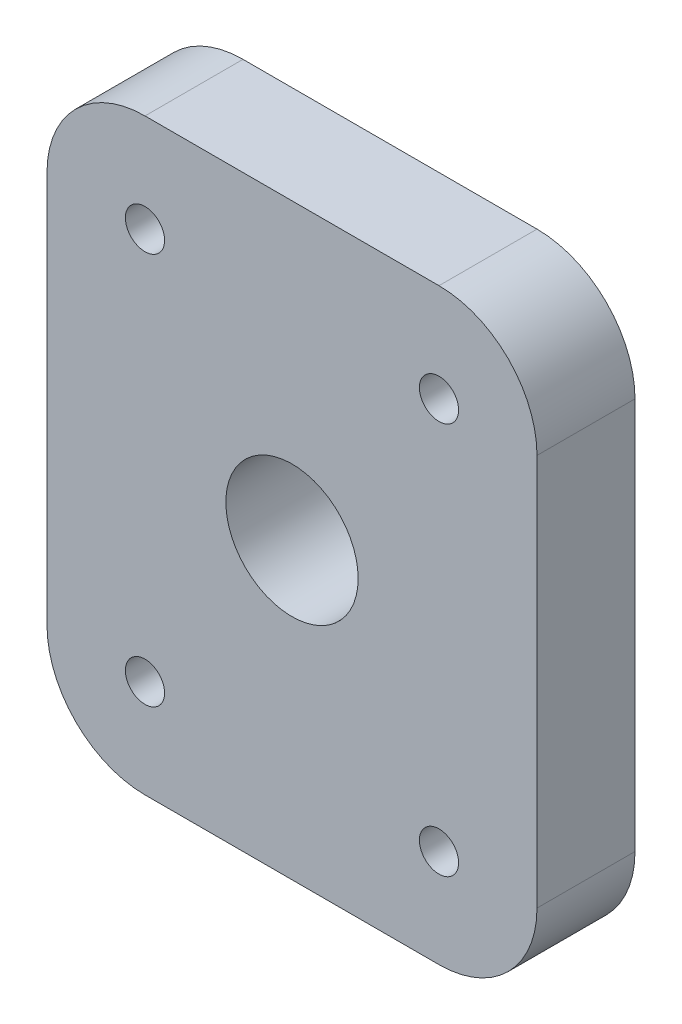
ISO-10303-21;
HEADER;
FILE_DESCRIPTION(('STEP AP214'),'2;1');
FILE_NAME('part.step','',(''),(''),'','','');
FILE_SCHEMA(('AUTOMOTIVE_DESIGN { 1 0 10303 214 1 1 1 1 }'));
ENDSEC;
DATA;
#1=APPLICATION_CONTEXT('core data for automotive mechanical design processes');
#2=APPLICATION_PROTOCOL_DEFINITION('international standard','automotive_design',2000,#1);
#3=PRODUCT_CONTEXT('',#1,'mechanical');
#4=PRODUCT('Part','Part','',(#3));
#5=PRODUCT_RELATED_PRODUCT_CATEGORY('part','',(#4));
#6=PRODUCT_DEFINITION_FORMATION('','',#4);
#7=PRODUCT_DEFINITION_CONTEXT('part definition',#1,'design');
#8=PRODUCT_DEFINITION('design','',#6,#7);
#9=PRODUCT_DEFINITION_SHAPE('','',#8);
#10=(LENGTH_UNIT() NAMED_UNIT(*) SI_UNIT(.MILLI.,.METRE.));
#11=(NAMED_UNIT(*) PLANE_ANGLE_UNIT() SI_UNIT($,.RADIAN.));
#12=(NAMED_UNIT(*) SI_UNIT($,.STERADIAN.) SOLID_ANGLE_UNIT());
#13=UNCERTAINTY_MEASURE_WITH_UNIT(LENGTH_MEASURE(1.E-05),#10,'distance_accuracy_value','');
#14=(GEOMETRIC_REPRESENTATION_CONTEXT(3) GLOBAL_UNCERTAINTY_ASSIGNED_CONTEXT((#13)) GLOBAL_UNIT_ASSIGNED_CONTEXT((#10,
#11,#12)) REPRESENTATION_CONTEXT('',''));
#15=CARTESIAN_POINT('',(0.,0.,0.));
#16=DIRECTION('',(0.,0.,1.));
#17=DIRECTION('',(1.,0.,0.));
#18=AXIS2_PLACEMENT_3D('',#15,#16,#17);
#19=CARTESIAN_POINT('',(116.9105691057,50.,10.));
#20=DIRECTION('',(0.,0.,1.));
#21=DIRECTION('',(1.,0.,0.));
#22=AXIS2_PLACEMENT_3D('',#19,#20,#21);
#23=PLANE('',#22);
#24=CARTESIAN_POINT('',(116.9105691057,50.,10.));
#25=DIRECTION('',(0.,0.,1.));
#26=DIRECTION('',(1.,0.,0.));
#27=AXIS2_PLACEMENT_3D('',#24,#25,#26);
#28=CIRCLE('',#27,2.00000000000003);
#29=CARTESIAN_POINT('',(118.9105691057,50.,10.));
#30=VERTEX_POINT('',#29);
#31=EDGE_CURVE('E194',#30,#30,#28,.T.);
#32=ORIENTED_EDGE('',*,*,#31,.F.);
#33=EDGE_LOOP('',(#32));
#34=FACE_BOUND('',#33,.T.);
#35=CARTESIAN_POINT('',(146.9105691057,10.,10.));
#36=DIRECTION('',(0.,0.,1.));
#37=DIRECTION('',(1.,0.,0.));
#38=AXIS2_PLACEMENT_3D('',#35,#36,#37);
#39=CIRCLE('',#38,2.00000000000006);
#40=CARTESIAN_POINT('',(148.9105691057,10.,10.));
#41=VERTEX_POINT('',#40);
#42=EDGE_CURVE('E182',#41,#41,#39,.T.);
#43=ORIENTED_EDGE('',*,*,#42,.F.);
#44=EDGE_LOOP('',(#43));
#45=FACE_BOUND('',#44,.T.);
#46=CARTESIAN_POINT('',(116.9105691057,50.,10.));
#47=DIRECTION('',(0.,0.,1.));
#48=DIRECTION('',(1.,0.,0.));
#49=AXIS2_PLACEMENT_3D('',#46,#47,#48);
#50=CIRCLE('',#49,10.);
#51=CARTESIAN_POINT('',(116.9105691057,60.,10.));
#52=VERTEX_POINT('',#51);
#53=CARTESIAN_POINT('',(106.9105691057,50.,10.));
#54=VERTEX_POINT('',#53);
#55=EDGE_CURVE('E145',#52,#54,#50,.T.);
#56=ORIENTED_EDGE('',*,*,#55,.T.);
#57=DIRECTION('',(0.,-1.,0.));
#58=VECTOR('',#57,1.);
#59=CARTESIAN_POINT('',(106.9105691057,50.,10.));
#60=LINE('',#59,#58);
#61=CARTESIAN_POINT('',(106.9105691057,10.,10.));
#62=VERTEX_POINT('',#61);
#63=EDGE_CURVE('E93',#54,#62,#60,.T.);
#64=ORIENTED_EDGE('',*,*,#63,.T.);
#65=CARTESIAN_POINT('',(116.9105691057,10.,10.));
#66=DIRECTION('',(0.,0.,1.));
#67=DIRECTION('',(1.,0.,0.));
#68=AXIS2_PLACEMENT_3D('',#65,#66,#67);
#69=CIRCLE('',#68,10.);
#70=CARTESIAN_POINT('',(116.9105691057,0.,10.));
#71=VERTEX_POINT('',#70);
#72=EDGE_CURVE('E160',#62,#71,#69,.T.);
#73=ORIENTED_EDGE('',*,*,#72,.T.);
#74=DIRECTION('',(1.,0.,0.));
#75=VECTOR('',#74,1.);
#76=CARTESIAN_POINT('',(116.9105691057,0.,10.));
#77=LINE('',#76,#75);
#78=CARTESIAN_POINT('',(146.9105691057,0.,10.));
#79=VERTEX_POINT('',#78);
#80=EDGE_CURVE('E173',#71,#79,#77,.T.);
#81=ORIENTED_EDGE('',*,*,#80,.T.);
#82=CARTESIAN_POINT('',(146.9105691057,10.,10.));
#83=DIRECTION('',(0.,0.,1.));
#84=DIRECTION('',(1.,0.,0.));
#85=AXIS2_PLACEMENT_3D('',#82,#83,#84);
#86=CIRCLE('',#85,10.);
#87=CARTESIAN_POINT('',(156.9105691057,10.,10.));
#88=VERTEX_POINT('',#87);
#89=EDGE_CURVE('E112',#79,#88,#86,.T.);
#90=ORIENTED_EDGE('',*,*,#89,.T.);
#91=DIRECTION('',(0.,1.,0.));
#92=VECTOR('',#91,1.);
#93=CARTESIAN_POINT('',(156.9105691057,10.,10.));
#94=LINE('',#93,#92);
#95=CARTESIAN_POINT('',(156.9105691057,50.,10.));
#96=VERTEX_POINT('',#95);
#97=EDGE_CURVE('E106',#88,#96,#94,.T.);
#98=ORIENTED_EDGE('',*,*,#97,.T.);
#99=CARTESIAN_POINT('',(146.9105691057,50.,10.));
#100=DIRECTION('',(0.,0.,1.));
#101=DIRECTION('',(1.,0.,0.));
#102=AXIS2_PLACEMENT_3D('',#99,#100,#101);
#103=CIRCLE('',#102,10.);
#104=CARTESIAN_POINT('',(146.9105691057,60.,10.));
#105=VERTEX_POINT('',#104);
#106=EDGE_CURVE('E110',#96,#105,#103,.T.);
#107=ORIENTED_EDGE('',*,*,#106,.T.);
#108=DIRECTION('',(-1.,0.,0.));
#109=VECTOR('',#108,1.);
#110=CARTESIAN_POINT('',(146.9105691057,60.,10.));
#111=LINE('',#110,#109);
#112=EDGE_CURVE('E50',#105,#52,#111,.T.);
#113=ORIENTED_EDGE('',*,*,#112,.T.);
#114=EDGE_LOOP('',(#56,#64,#73,#81,#90,#98,#107,#113));
#115=FACE_BOUND('',#114,.T.);
#116=CARTESIAN_POINT('',(131.9105691057,30.,10.));
#117=DIRECTION('',(0.,0.,1.));
#118=DIRECTION('',(1.,0.,0.));
#119=AXIS2_PLACEMENT_3D('',#116,#117,#118);
#120=CIRCLE('',#119,6.75000000000012);
#121=CARTESIAN_POINT('',(138.6605691057,30.,10.));
#122=VERTEX_POINT('',#121);
#123=EDGE_CURVE('E134',#122,#122,#120,.T.);
#124=ORIENTED_EDGE('',*,*,#123,.F.);
#125=EDGE_LOOP('',(#124));
#126=FACE_BOUND('',#125,.T.);
#127=CARTESIAN_POINT('',(146.9105691057,50.,10.));
#128=DIRECTION('',(0.,0.,1.));
#129=DIRECTION('',(1.,0.,0.));
#130=AXIS2_PLACEMENT_3D('',#127,#128,#129);
#131=CIRCLE('',#130,2.00000000000003);
#132=CARTESIAN_POINT('',(148.9105691057,50.,10.));
#133=VERTEX_POINT('',#132);
#134=EDGE_CURVE('E188',#133,#133,#131,.T.);
#135=ORIENTED_EDGE('',*,*,#134,.F.);
#136=EDGE_LOOP('',(#135));
#137=FACE_BOUND('',#136,.T.);
#138=CARTESIAN_POINT('',(116.9105691057,10.,10.));
#139=DIRECTION('',(0.,0.,1.));
#140=DIRECTION('',(1.,0.,0.));
#141=AXIS2_PLACEMENT_3D('',#138,#139,#140);
#142=CIRCLE('',#141,2.00000000000003);
#143=CARTESIAN_POINT('',(118.9105691057,10.,10.));
#144=VERTEX_POINT('',#143);
#145=EDGE_CURVE('E200',#144,#144,#142,.T.);
#146=ORIENTED_EDGE('',*,*,#145,.F.);
#147=EDGE_LOOP('',(#146));
#148=FACE_BOUND('',#147,.T.);
#149=ADVANCED_FACE('F33',(#34,#45,#115,#126,#137,#148),#23,.T.);
#150=CARTESIAN_POINT('',(116.9105691057,50.,0.));
#151=DIRECTION('',(0.,0.,1.));
#152=DIRECTION('',(1.,0.,0.));
#153=AXIS2_PLACEMENT_3D('',#150,#151,#152);
#154=PLANE('',#153);
#155=CARTESIAN_POINT('',(116.9105691057,50.,0.));
#156=DIRECTION('',(0.,0.,1.));
#157=DIRECTION('',(1.,0.,0.));
#158=AXIS2_PLACEMENT_3D('',#155,#156,#157);
#159=CIRCLE('',#158,10.);
#160=CARTESIAN_POINT('',(116.9105691057,60.,0.));
#161=VERTEX_POINT('',#160);
#162=CARTESIAN_POINT('',(106.9105691057,50.,0.));
#163=VERTEX_POINT('',#162);
#164=EDGE_CURVE('E130',#161,#163,#159,.T.);
#165=ORIENTED_EDGE('',*,*,#164,.F.);
#166=DIRECTION('',(-1.,0.,0.));
#167=VECTOR('',#166,1.);
#168=CARTESIAN_POINT('',(146.9105691057,60.,0.));
#169=LINE('',#168,#167);
#170=CARTESIAN_POINT('',(146.9105691057,60.,0.));
#171=VERTEX_POINT('',#170);
#172=EDGE_CURVE('E85',#171,#161,#169,.T.);
#173=ORIENTED_EDGE('',*,*,#172,.F.);
#174=CARTESIAN_POINT('',(146.9105691057,50.,0.));
#175=DIRECTION('',(0.,0.,1.));
#176=DIRECTION('',(1.,0.,0.));
#177=AXIS2_PLACEMENT_3D('',#174,#175,#176);
#178=CIRCLE('',#177,10.);
#179=CARTESIAN_POINT('',(156.9105691057,50.,0.));
#180=VERTEX_POINT('',#179);
#181=EDGE_CURVE('E79',#180,#171,#178,.T.);
#182=ORIENTED_EDGE('',*,*,#181,.F.);
#183=DIRECTION('',(0.,1.,0.));
#184=VECTOR('',#183,1.);
#185=CARTESIAN_POINT('',(156.9105691057,10.,0.));
#186=LINE('',#185,#184);
#187=CARTESIAN_POINT('',(156.9105691057,10.,0.));
#188=VERTEX_POINT('',#187);
#189=EDGE_CURVE('E120',#188,#180,#186,.T.);
#190=ORIENTED_EDGE('',*,*,#189,.F.);
#191=CARTESIAN_POINT('',(146.9105691057,10.,0.));
#192=DIRECTION('',(0.,0.,1.));
#193=DIRECTION('',(1.,0.,0.));
#194=AXIS2_PLACEMENT_3D('',#191,#192,#193);
#195=CIRCLE('',#194,10.);
#196=CARTESIAN_POINT('',(146.9105691057,0.,0.));
#197=VERTEX_POINT('',#196);
#198=EDGE_CURVE('E140',#197,#188,#195,.T.);
#199=ORIENTED_EDGE('',*,*,#198,.F.);
#200=DIRECTION('',(1.,0.,0.));
#201=VECTOR('',#200,1.);
#202=CARTESIAN_POINT('',(116.9105691057,0.,0.));
#203=LINE('',#202,#201);
#204=CARTESIAN_POINT('',(116.9105691057,0.,0.));
#205=VERTEX_POINT('',#204);
#206=EDGE_CURVE('E138',#205,#197,#203,.T.);
#207=ORIENTED_EDGE('',*,*,#206,.F.);
#208=CARTESIAN_POINT('',(116.9105691057,10.,0.));
#209=DIRECTION('',(0.,0.,1.));
#210=DIRECTION('',(1.,0.,0.));
#211=AXIS2_PLACEMENT_3D('',#208,#209,#210);
#212=CIRCLE('',#211,10.);
#213=CARTESIAN_POINT('',(106.9105691057,10.,0.));
#214=VERTEX_POINT('',#213);
#215=EDGE_CURVE('E136',#214,#205,#212,.T.);
#216=ORIENTED_EDGE('',*,*,#215,.F.);
#217=DIRECTION('',(0.,-1.,0.));
#218=VECTOR('',#217,1.);
#219=CARTESIAN_POINT('',(106.9105691057,50.,0.));
#220=LINE('',#219,#218);
#221=EDGE_CURVE('E133',#163,#214,#220,.T.);
#222=ORIENTED_EDGE('',*,*,#221,.F.);
#223=EDGE_LOOP('',(#165,#173,#182,#190,#199,#207,#216,#222));
#224=FACE_BOUND('',#223,.T.);
#225=CARTESIAN_POINT('',(131.9105691057,30.,0.));
#226=DIRECTION('',(0.,0.,1.));
#227=DIRECTION('',(1.,0.,0.));
#228=AXIS2_PLACEMENT_3D('',#225,#226,#227);
#229=CIRCLE('',#228,6.75000000000012);
#230=CARTESIAN_POINT('',(138.6605691057,30.,0.));
#231=VERTEX_POINT('',#230);
#232=EDGE_CURVE('E179',#231,#231,#229,.T.);
#233=ORIENTED_EDGE('',*,*,#232,.T.);
#234=EDGE_LOOP('',(#233));
#235=FACE_BOUND('',#234,.T.);
#236=CARTESIAN_POINT('',(146.9105691057,10.,0.));
#237=DIRECTION('',(0.,0.,1.));
#238=DIRECTION('',(1.,0.,0.));
#239=AXIS2_PLACEMENT_3D('',#236,#237,#238);
#240=CIRCLE('',#239,2.00000000000006);
#241=CARTESIAN_POINT('',(148.9105691057,10.,0.));
#242=VERTEX_POINT('',#241);
#243=EDGE_CURVE('E185',#242,#242,#240,.T.);
#244=ORIENTED_EDGE('',*,*,#243,.T.);
#245=EDGE_LOOP('',(#244));
#246=FACE_BOUND('',#245,.T.);
#247=CARTESIAN_POINT('',(146.9105691057,50.,0.));
#248=DIRECTION('',(0.,0.,1.));
#249=DIRECTION('',(1.,0.,0.));
#250=AXIS2_PLACEMENT_3D('',#247,#248,#249);
#251=CIRCLE('',#250,2.00000000000003);
#252=CARTESIAN_POINT('',(148.9105691057,50.,0.));
#253=VERTEX_POINT('',#252);
#254=EDGE_CURVE('E191',#253,#253,#251,.T.);
#255=ORIENTED_EDGE('',*,*,#254,.T.);
#256=EDGE_LOOP('',(#255));
#257=FACE_BOUND('',#256,.T.);
#258=CARTESIAN_POINT('',(116.9105691057,50.,0.));
#259=DIRECTION('',(0.,0.,1.));
#260=DIRECTION('',(1.,0.,0.));
#261=AXIS2_PLACEMENT_3D('',#258,#259,#260);
#262=CIRCLE('',#261,2.00000000000003);
#263=CARTESIAN_POINT('',(118.9105691057,50.,0.));
#264=VERTEX_POINT('',#263);
#265=EDGE_CURVE('E197',#264,#264,#262,.T.);
#266=ORIENTED_EDGE('',*,*,#265,.T.);
#267=EDGE_LOOP('',(#266));
#268=FACE_BOUND('',#267,.T.);
#269=CARTESIAN_POINT('',(116.9105691057,10.,0.));
#270=DIRECTION('',(0.,0.,1.));
#271=DIRECTION('',(1.,0.,0.));
#272=AXIS2_PLACEMENT_3D('',#269,#270,#271);
#273=CIRCLE('',#272,2.00000000000003);
#274=CARTESIAN_POINT('',(118.9105691057,10.,0.));
#275=VERTEX_POINT('',#274);
#276=EDGE_CURVE('E203',#275,#275,#273,.T.);
#277=ORIENTED_EDGE('',*,*,#276,.T.);
#278=EDGE_LOOP('',(#277));
#279=FACE_BOUND('',#278,.T.);
#280=ADVANCED_FACE('F164',(#224,#235,#246,#257,#268,#279),#154,.F.);
#281=CARTESIAN_POINT('',(116.9105691057,50.,10.));
#282=DIRECTION('',(0.,0.,-1.));
#283=DIRECTION('',(-1.,0.,0.));
#284=AXIS2_PLACEMENT_3D('',#281,#282,#283);
#285=CYLINDRICAL_SURFACE('',#284,10.);
#286=ORIENTED_EDGE('',*,*,#164,.T.);
#287=DIRECTION('',(0.,0.,-1.));
#288=VECTOR('',#287,1.);
#289=CARTESIAN_POINT('',(106.9105691057,50.,10.));
#290=LINE('',#289,#288);
#291=EDGE_CURVE('E11',#54,#163,#290,.T.);
#292=ORIENTED_EDGE('',*,*,#291,.F.);
#293=ORIENTED_EDGE('',*,*,#55,.F.);
#294=DIRECTION('',(0.,0.,-1.));
#295=VECTOR('',#294,1.);
#296=CARTESIAN_POINT('',(116.9105691057,60.,10.));
#297=LINE('',#296,#295);
#298=EDGE_CURVE('E126',#52,#161,#297,.T.);
#299=ORIENTED_EDGE('',*,*,#298,.T.);
#300=EDGE_LOOP('',(#286,#292,#293,#299));
#301=FACE_BOUND('',#300,.T.);
#302=ADVANCED_FACE('F35',(#301),#285,.T.);
#303=CARTESIAN_POINT('',(106.9105691057,50.,10.));
#304=DIRECTION('',(1.,0.,0.));
#305=DIRECTION('',(0.,0.,-1.));
#306=AXIS2_PLACEMENT_3D('',#303,#304,#305);
#307=PLANE('',#306);
#308=ORIENTED_EDGE('',*,*,#221,.T.);
#309=DIRECTION('',(0.,0.,-1.));
#310=VECTOR('',#309,1.);
#311=CARTESIAN_POINT('',(106.9105691057,10.,10.));
#312=LINE('',#311,#310);
#313=EDGE_CURVE('E42',#62,#214,#312,.T.);
#314=ORIENTED_EDGE('',*,*,#313,.F.);
#315=ORIENTED_EDGE('',*,*,#63,.F.);
#316=ORIENTED_EDGE('',*,*,#291,.T.);
#317=EDGE_LOOP('',(#308,#314,#315,#316));
#318=FACE_BOUND('',#317,.T.);
#319=ADVANCED_FACE('F237',(#318),#307,.F.);
#320=CARTESIAN_POINT('',(116.9105691057,10.,10.));
#321=DIRECTION('',(0.,0.,-1.));
#322=DIRECTION('',(-1.,0.,0.));
#323=AXIS2_PLACEMENT_3D('',#320,#321,#322);
#324=CYLINDRICAL_SURFACE('',#323,10.);
#325=ORIENTED_EDGE('',*,*,#215,.T.);
#326=DIRECTION('',(0.,0.,-1.));
#327=VECTOR('',#326,1.);
#328=CARTESIAN_POINT('',(116.9105691057,0.,10.));
#329=LINE('',#328,#327);
#330=EDGE_CURVE('E152',#71,#205,#329,.T.);
#331=ORIENTED_EDGE('',*,*,#330,.F.);
#332=ORIENTED_EDGE('',*,*,#72,.F.);
#333=ORIENTED_EDGE('',*,*,#313,.T.);
#334=EDGE_LOOP('',(#325,#331,#332,#333));
#335=FACE_BOUND('',#334,.T.);
#336=ADVANCED_FACE('F158',(#335),#324,.T.);
#337=CARTESIAN_POINT('',(116.9105691057,0.,10.));
#338=DIRECTION('',(0.,1.,0.));
#339=DIRECTION('',(0.,0.,1.));
#340=AXIS2_PLACEMENT_3D('',#337,#338,#339);
#341=PLANE('',#340);
#342=ORIENTED_EDGE('',*,*,#206,.T.);
#343=DIRECTION('',(0.,0.,-1.));
#344=VECTOR('',#343,1.);
#345=CARTESIAN_POINT('',(146.9105691057,0.,10.));
#346=LINE('',#345,#344);
#347=EDGE_CURVE('E149',#79,#197,#346,.T.);
#348=ORIENTED_EDGE('',*,*,#347,.F.);
#349=ORIENTED_EDGE('',*,*,#80,.F.);
#350=ORIENTED_EDGE('',*,*,#330,.T.);
#351=EDGE_LOOP('',(#342,#348,#349,#350));
#352=FACE_BOUND('',#351,.T.);
#353=ADVANCED_FACE('F169',(#352),#341,.F.);
#354=CARTESIAN_POINT('',(146.9105691057,10.,10.));
#355=DIRECTION('',(0.,0.,-1.));
#356=DIRECTION('',(-1.,0.,0.));
#357=AXIS2_PLACEMENT_3D('',#354,#355,#356);
#358=CYLINDRICAL_SURFACE('',#357,10.);
#359=ORIENTED_EDGE('',*,*,#198,.T.);
#360=DIRECTION('',(0.,0.,-1.));
#361=VECTOR('',#360,1.);
#362=CARTESIAN_POINT('',(156.9105691057,10.,10.));
#363=LINE('',#362,#361);
#364=EDGE_CURVE('E121',#88,#188,#363,.T.);
#365=ORIENTED_EDGE('',*,*,#364,.F.);
#366=ORIENTED_EDGE('',*,*,#89,.F.);
#367=ORIENTED_EDGE('',*,*,#347,.T.);
#368=EDGE_LOOP('',(#359,#365,#366,#367));
#369=FACE_BOUND('',#368,.T.);
#370=ADVANCED_FACE('F172',(#369),#358,.T.);
#371=CARTESIAN_POINT('',(156.9105691057,10.,10.));
#372=DIRECTION('',(-1.,0.,0.));
#373=DIRECTION('',(0.,0.,1.));
#374=AXIS2_PLACEMENT_3D('',#371,#372,#373);
#375=PLANE('',#374);
#376=ORIENTED_EDGE('',*,*,#189,.T.);
#377=DIRECTION('',(0.,0.,-1.));
#378=VECTOR('',#377,1.);
#379=CARTESIAN_POINT('',(156.9105691057,50.,10.));
#380=LINE('',#379,#378);
#381=EDGE_CURVE('E117',#96,#180,#380,.T.);
#382=ORIENTED_EDGE('',*,*,#381,.F.);
#383=ORIENTED_EDGE('',*,*,#97,.F.);
#384=ORIENTED_EDGE('',*,*,#364,.T.);
#385=EDGE_LOOP('',(#376,#382,#383,#384));
#386=FACE_BOUND('',#385,.T.);
#387=ADVANCED_FACE('F118',(#386),#375,.F.);
#388=CARTESIAN_POINT('',(146.9105691057,50.,10.));
#389=DIRECTION('',(0.,0.,-1.));
#390=DIRECTION('',(-1.,0.,0.));
#391=AXIS2_PLACEMENT_3D('',#388,#389,#390);
#392=CYLINDRICAL_SURFACE('',#391,10.);
#393=ORIENTED_EDGE('',*,*,#181,.T.);
#394=DIRECTION('',(0.,0.,-1.));
#395=VECTOR('',#394,1.);
#396=CARTESIAN_POINT('',(146.9105691057,60.,10.));
#397=LINE('',#396,#395);
#398=EDGE_CURVE('E122',#105,#171,#397,.T.);
#399=ORIENTED_EDGE('',*,*,#398,.F.);
#400=ORIENTED_EDGE('',*,*,#106,.F.);
#401=ORIENTED_EDGE('',*,*,#381,.T.);
#402=EDGE_LOOP('',(#393,#399,#400,#401));
#403=FACE_BOUND('',#402,.T.);
#404=ADVANCED_FACE('F124',(#403),#392,.T.);
#405=CARTESIAN_POINT('',(146.9105691057,60.,10.));
#406=DIRECTION('',(0.,-1.,0.));
#407=DIRECTION('',(0.,0.,-1.));
#408=AXIS2_PLACEMENT_3D('',#405,#406,#407);
#409=PLANE('',#408);
#410=ORIENTED_EDGE('',*,*,#172,.T.);
#411=ORIENTED_EDGE('',*,*,#298,.F.);
#412=ORIENTED_EDGE('',*,*,#112,.F.);
#413=ORIENTED_EDGE('',*,*,#398,.T.);
#414=EDGE_LOOP('',(#410,#411,#412,#413));
#415=FACE_BOUND('',#414,.T.);
#416=ADVANCED_FACE('F225',(#415),#409,.F.);
#417=CARTESIAN_POINT('',(131.9105691057,30.,10.));
#418=DIRECTION('',(0.,0.,-1.));
#419=DIRECTION('',(-1.,0.,0.));
#420=AXIS2_PLACEMENT_3D('',#417,#418,#419);
#421=CYLINDRICAL_SURFACE('',#420,6.75000000000012);
#422=ORIENTED_EDGE('',*,*,#123,.T.);
#423=EDGE_LOOP('',(#422));
#424=FACE_BOUND('',#423,.T.);
#425=ORIENTED_EDGE('',*,*,#232,.F.);
#426=EDGE_LOOP('',(#425));
#427=FACE_BOUND('',#426,.T.);
#428=ADVANCED_FACE('F222',(#424,#427),#421,.F.);
#429=CARTESIAN_POINT('',(146.9105691057,10.,10.));
#430=DIRECTION('',(0.,0.,-1.));
#431=DIRECTION('',(-1.,0.,0.));
#432=AXIS2_PLACEMENT_3D('',#429,#430,#431);
#433=CYLINDRICAL_SURFACE('',#432,2.00000000000006);
#434=ORIENTED_EDGE('',*,*,#42,.T.);
#435=EDGE_LOOP('',(#434));
#436=FACE_BOUND('',#435,.T.);
#437=ORIENTED_EDGE('',*,*,#243,.F.);
#438=EDGE_LOOP('',(#437));
#439=FACE_BOUND('',#438,.T.);
#440=ADVANCED_FACE('F301',(#436,#439),#433,.F.);
#441=CARTESIAN_POINT('',(146.9105691057,50.,10.));
#442=DIRECTION('',(0.,0.,-1.));
#443=DIRECTION('',(-1.,0.,0.));
#444=AXIS2_PLACEMENT_3D('',#441,#442,#443);
#445=CYLINDRICAL_SURFACE('',#444,2.00000000000003);
#446=ORIENTED_EDGE('',*,*,#134,.T.);
#447=EDGE_LOOP('',(#446));
#448=FACE_BOUND('',#447,.T.);
#449=ORIENTED_EDGE('',*,*,#254,.F.);
#450=EDGE_LOOP('',(#449));
#451=FACE_BOUND('',#450,.T.);
#452=ADVANCED_FACE('F309',(#448,#451),#445,.F.);
#453=CARTESIAN_POINT('',(116.9105691057,50.,10.));
#454=DIRECTION('',(0.,0.,-1.));
#455=DIRECTION('',(-1.,0.,0.));
#456=AXIS2_PLACEMENT_3D('',#453,#454,#455);
#457=CYLINDRICAL_SURFACE('',#456,2.00000000000003);
#458=ORIENTED_EDGE('',*,*,#31,.T.);
#459=EDGE_LOOP('',(#458));
#460=FACE_BOUND('',#459,.T.);
#461=ORIENTED_EDGE('',*,*,#265,.F.);
#462=EDGE_LOOP('',(#461));
#463=FACE_BOUND('',#462,.T.);
#464=ADVANCED_FACE('F317',(#460,#463),#457,.F.);
#465=CARTESIAN_POINT('',(116.9105691057,10.,10.));
#466=DIRECTION('',(0.,0.,-1.));
#467=DIRECTION('',(-1.,0.,0.));
#468=AXIS2_PLACEMENT_3D('',#465,#466,#467);
#469=CYLINDRICAL_SURFACE('',#468,2.00000000000003);
#470=ORIENTED_EDGE('',*,*,#145,.T.);
#471=EDGE_LOOP('',(#470));
#472=FACE_BOUND('',#471,.T.);
#473=ORIENTED_EDGE('',*,*,#276,.F.);
#474=EDGE_LOOP('',(#473));
#475=FACE_BOUND('',#474,.T.);
#476=ADVANCED_FACE('F209',(#472,#475),#469,.F.);
#477=CLOSED_SHELL('',(#149,#280,#302,#319,#336,#353,#370,#387,#404,#416,#428,#440,#452,#464,#476));
#478=MANIFOLD_SOLID_BREP('B2',#477);
#479=ADVANCED_BREP_SHAPE_REPRESENTATION('',(#18,#478),#14);
#480=SHAPE_DEFINITION_REPRESENTATION(#9,#479);
ENDSEC;
END-ISO-10303-21;
